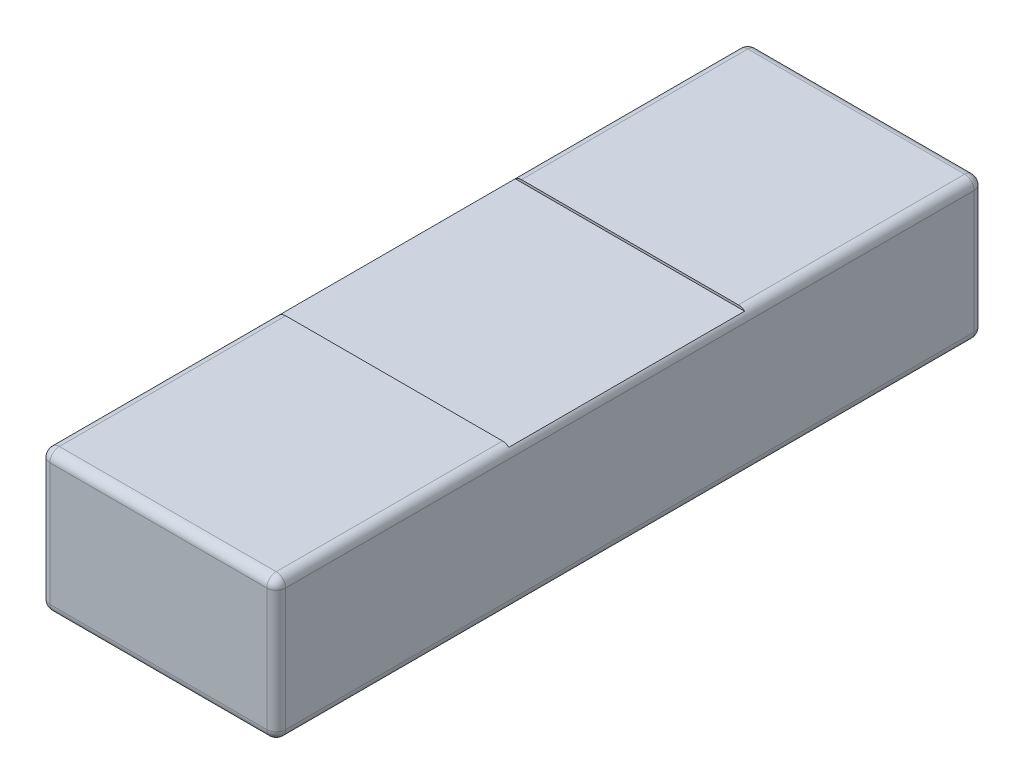
ISO-10303-21;
HEADER;
FILE_DESCRIPTION(('STEP AP214'),'2;1');
FILE_NAME('part.step','',(''),(''),'','','');
FILE_SCHEMA(('AUTOMOTIVE_DESIGN { 1 0 10303 214 1 1 1 1 }'));
ENDSEC;
DATA;
#1=APPLICATION_CONTEXT('core data for automotive mechanical design processes');
#2=APPLICATION_PROTOCOL_DEFINITION('international standard','automotive_design',2000,#1);
#3=PRODUCT_CONTEXT('',#1,'mechanical');
#4=PRODUCT('Part','Part','',(#3));
#5=PRODUCT_RELATED_PRODUCT_CATEGORY('part','',(#4));
#6=PRODUCT_DEFINITION_FORMATION('','',#4);
#7=PRODUCT_DEFINITION_CONTEXT('part definition',#1,'design');
#8=PRODUCT_DEFINITION('design','',#6,#7);
#9=PRODUCT_DEFINITION_SHAPE('','',#8);
#10=(LENGTH_UNIT() NAMED_UNIT(*) SI_UNIT(.MILLI.,.METRE.));
#11=(NAMED_UNIT(*) PLANE_ANGLE_UNIT() SI_UNIT($,.RADIAN.));
#12=(NAMED_UNIT(*) SI_UNIT($,.STERADIAN.) SOLID_ANGLE_UNIT());
#13=UNCERTAINTY_MEASURE_WITH_UNIT(LENGTH_MEASURE(1.E-05),#10,'distance_accuracy_value','');
#14=(GEOMETRIC_REPRESENTATION_CONTEXT(3) GLOBAL_UNCERTAINTY_ASSIGNED_CONTEXT((#13)) GLOBAL_UNIT_ASSIGNED_CONTEXT((#10,
#11,#12)) REPRESENTATION_CONTEXT('',''));
#15=CARTESIAN_POINT('',(0.,0.,0.));
#16=DIRECTION('',(0.,0.,1.));
#17=DIRECTION('',(1.,0.,0.));
#18=AXIS2_PLACEMENT_3D('',#15,#16,#17);
#19=CARTESIAN_POINT('',(0.,0.,0.));
#20=DIRECTION('',(0.,1.,0.));
#21=DIRECTION('',(0.,0.,1.));
#22=AXIS2_PLACEMENT_3D('',#19,#20,#21);
#23=PLANE('',#22);
#24=DIRECTION('',(0.,0.,-1.));
#25=VECTOR('',#24,1.);
#26=CARTESIAN_POINT('',(23.,0.,0.));
#27=LINE('',#26,#25);
#28=CARTESIAN_POINT('',(23.,0.,-73.));
#29=VERTEX_POINT('',#28);
#30=CARTESIAN_POINT('',(23.,0.,-25.));
#31=VERTEX_POINT('',#30);
#32=EDGE_CURVE('E207',#29,#31,#27,.F.);
#33=ORIENTED_EDGE('',*,*,#32,.T.);
#34=DIRECTION('',(1.,0.,0.));
#35=VECTOR('',#34,1.);
#36=CARTESIAN_POINT('',(-42.2838274871656,0.,-25.));
#37=LINE('',#36,#35);
#38=CARTESIAN_POINT('',(-23.,0.,-25.));
#39=VERTEX_POINT('',#38);
#40=EDGE_CURVE('E198',#39,#31,#37,.T.);
#41=ORIENTED_EDGE('',*,*,#40,.F.);
#42=DIRECTION('',(0.,0.,1.));
#43=VECTOR('',#42,1.);
#44=CARTESIAN_POINT('',(-23.,0.,0.));
#45=LINE('',#44,#43);
#46=CARTESIAN_POINT('',(-23.,0.,-73.));
#47=VERTEX_POINT('',#46);
#48=EDGE_CURVE('E429',#39,#47,#45,.F.);
#49=ORIENTED_EDGE('',*,*,#48,.T.);
#50=DIRECTION('',(-1.,0.,0.));
#51=VECTOR('',#50,1.);
#52=CARTESIAN_POINT('',(0.,0.,-73.));
#53=LINE('',#52,#51);
#54=EDGE_CURVE('E214',#47,#29,#53,.F.);
#55=ORIENTED_EDGE('',*,*,#54,.T.);
#56=EDGE_LOOP('',(#33,#41,#49,#55));
#57=FACE_BOUND('',#56,.T.);
#58=ADVANCED_FACE('F42',(#57),#23,.F.);
#59=CARTESIAN_POINT('',(0.,30.,0.));
#60=DIRECTION('',(0.,1.,0.));
#61=DIRECTION('',(0.,0.,1.));
#62=AXIS2_PLACEMENT_3D('',#59,#60,#61);
#63=PLANE('',#62);
#64=DIRECTION('',(1.,0.,0.));
#65=VECTOR('',#64,1.);
#66=CARTESIAN_POINT('',(-49.869727137544,30.,25.));
#67=LINE('',#66,#65);
#68=CARTESIAN_POINT('',(-23.,30.,25.));
#69=VERTEX_POINT('',#68);
#70=CARTESIAN_POINT('',(23.,30.,25.));
#71=VERTEX_POINT('',#70);
#72=EDGE_CURVE('E401',#69,#71,#67,.T.);
#73=ORIENTED_EDGE('',*,*,#72,.F.);
#74=DIRECTION('',(0.,0.,1.));
#75=VECTOR('',#74,1.);
#76=CARTESIAN_POINT('',(-23.,30.,75.));
#77=LINE('',#76,#75);
#78=CARTESIAN_POINT('',(-23.,30.,73.));
#79=VERTEX_POINT('',#78);
#80=EDGE_CURVE('E243',#69,#79,#77,.T.);
#81=ORIENTED_EDGE('',*,*,#80,.T.);
#82=DIRECTION('',(1.,0.,0.));
#83=VECTOR('',#82,1.);
#84=CARTESIAN_POINT('',(25.,30.,73.));
#85=LINE('',#84,#83);
#86=CARTESIAN_POINT('',(23.,30.,73.));
#87=VERTEX_POINT('',#86);
#88=EDGE_CURVE('E251',#79,#87,#85,.T.);
#89=ORIENTED_EDGE('',*,*,#88,.T.);
#90=DIRECTION('',(0.,0.,-1.));
#91=VECTOR('',#90,1.);
#92=CARTESIAN_POINT('',(23.,30.,-75.));
#93=LINE('',#92,#91);
#94=EDGE_CURVE('E256',#87,#71,#93,.T.);
#95=ORIENTED_EDGE('',*,*,#94,.T.);
#96=EDGE_LOOP('',(#73,#81,#89,#95));
#97=FACE_BOUND('',#96,.T.);
#98=ADVANCED_FACE('F497',(#97),#63,.T.);
#99=CARTESIAN_POINT('',(25.,30.,-75.));
#100=DIRECTION('',(-1.,0.,0.));
#101=DIRECTION('',(0.,0.,1.));
#102=AXIS2_PLACEMENT_3D('',#99,#100,#101);
#103=PLANE('',#102);
#104=DIRECTION('',(0.,-1.,0.));
#105=VECTOR('',#104,1.);
#106=CARTESIAN_POINT('',(25.,30.,73.));
#107=LINE('',#106,#105);
#108=CARTESIAN_POINT('',(25.,28.,73.));
#109=VERTEX_POINT('',#108);
#110=CARTESIAN_POINT('',(25.,2.,73.));
#111=VERTEX_POINT('',#110);
#112=EDGE_CURVE('E422',#109,#111,#107,.T.);
#113=ORIENTED_EDGE('',*,*,#112,.T.);
#114=DIRECTION('',(0.,0.,-1.));
#115=VECTOR('',#114,1.);
#116=CARTESIAN_POINT('',(25.,2.,-75.));
#117=LINE('',#116,#115);
#118=CARTESIAN_POINT('',(25.,2.,-73.));
#119=VERTEX_POINT('',#118);
#120=EDGE_CURVE('E425',#111,#119,#117,.T.);
#121=ORIENTED_EDGE('',*,*,#120,.T.);
#122=DIRECTION('',(0.,-1.,0.));
#123=VECTOR('',#122,1.);
#124=CARTESIAN_POINT('',(25.,30.,-73.));
#125=LINE('',#124,#123);
#126=CARTESIAN_POINT('',(25.,28.,-73.));
#127=VERTEX_POINT('',#126);
#128=EDGE_CURVE('E419',#119,#127,#125,.F.);
#129=ORIENTED_EDGE('',*,*,#128,.T.);
#130=DIRECTION('',(0.,0.,-1.));
#131=VECTOR('',#130,1.);
#132=CARTESIAN_POINT('',(25.,28.,75.));
#133=LINE('',#132,#131);
#134=EDGE_CURVE('E363',#127,#109,#133,.F.);
#135=ORIENTED_EDGE('',*,*,#134,.T.);
#136=EDGE_LOOP('',(#113,#121,#129,#135));
#137=FACE_BOUND('',#136,.T.);
#138=ADVANCED_FACE('F451',(#137),#103,.F.);
#139=CARTESIAN_POINT('',(-25.,30.,-75.));
#140=DIRECTION('',(0.,0.,1.));
#141=DIRECTION('',(1.,0.,0.));
#142=AXIS2_PLACEMENT_3D('',#139,#140,#141);
#143=PLANE('',#142);
#144=DIRECTION('',(-1.,0.,0.));
#145=VECTOR('',#144,1.);
#146=CARTESIAN_POINT('',(25.,28.,-75.));
#147=LINE('',#146,#145);
#148=CARTESIAN_POINT('',(-23.,28.,-75.));
#149=VERTEX_POINT('',#148);
#150=CARTESIAN_POINT('',(23.,28.,-75.));
#151=VERTEX_POINT('',#150);
#152=EDGE_CURVE('E233',#149,#151,#147,.F.);
#153=ORIENTED_EDGE('',*,*,#152,.T.);
#154=DIRECTION('',(0.,-1.,0.));
#155=VECTOR('',#154,1.);
#156=CARTESIAN_POINT('',(23.,30.,-75.));
#157=LINE('',#156,#155);
#158=CARTESIAN_POINT('',(23.,2.,-75.));
#159=VERTEX_POINT('',#158);
#160=EDGE_CURVE('E239',#151,#159,#157,.T.);
#161=ORIENTED_EDGE('',*,*,#160,.T.);
#162=DIRECTION('',(-1.,0.,0.));
#163=VECTOR('',#162,1.);
#164=CARTESIAN_POINT('',(-25.,2.,-75.));
#165=LINE('',#164,#163);
#166=CARTESIAN_POINT('',(-23.,2.,-75.));
#167=VERTEX_POINT('',#166);
#168=EDGE_CURVE('E236',#159,#167,#165,.T.);
#169=ORIENTED_EDGE('',*,*,#168,.T.);
#170=DIRECTION('',(0.,-1.,0.));
#171=VECTOR('',#170,1.);
#172=CARTESIAN_POINT('',(-23.,30.,-75.));
#173=LINE('',#172,#171);
#174=EDGE_CURVE('E230',#167,#149,#173,.F.);
#175=ORIENTED_EDGE('',*,*,#174,.T.);
#176=EDGE_LOOP('',(#153,#161,#169,#175));
#177=FACE_BOUND('',#176,.T.);
#178=ADVANCED_FACE('F518',(#177),#143,.F.);
#179=CARTESIAN_POINT('',(-25.,30.,-75.));
#180=DIRECTION('',(1.,0.,0.));
#181=DIRECTION('',(0.,0.,-1.));
#182=AXIS2_PLACEMENT_3D('',#179,#180,#181);
#183=PLANE('',#182);
#184=DIRECTION('',(0.,0.,1.));
#185=VECTOR('',#184,1.);
#186=CARTESIAN_POINT('',(-25.,28.,-75.));
#187=LINE('',#186,#185);
#188=CARTESIAN_POINT('',(-25.,28.,73.));
#189=VERTEX_POINT('',#188);
#190=CARTESIAN_POINT('',(-25.,28.,-73.));
#191=VERTEX_POINT('',#190);
#192=EDGE_CURVE('E266',#189,#191,#187,.F.);
#193=ORIENTED_EDGE('',*,*,#192,.T.);
#194=DIRECTION('',(0.,-1.,0.));
#195=VECTOR('',#194,1.);
#196=CARTESIAN_POINT('',(-25.,30.,-73.));
#197=LINE('',#196,#195);
#198=CARTESIAN_POINT('',(-25.,2.,-73.));
#199=VERTEX_POINT('',#198);
#200=EDGE_CURVE('E269',#191,#199,#197,.T.);
#201=ORIENTED_EDGE('',*,*,#200,.T.);
#202=DIRECTION('',(0.,0.,1.));
#203=VECTOR('',#202,1.);
#204=CARTESIAN_POINT('',(-25.,2.,-75.));
#205=LINE('',#204,#203);
#206=CARTESIAN_POINT('',(-25.,2.,73.));
#207=VERTEX_POINT('',#206);
#208=EDGE_CURVE('E260',#199,#207,#205,.T.);
#209=ORIENTED_EDGE('',*,*,#208,.T.);
#210=DIRECTION('',(0.,-1.,0.));
#211=VECTOR('',#210,1.);
#212=CARTESIAN_POINT('',(-25.,30.,73.));
#213=LINE('',#212,#211);
#214=EDGE_CURVE('E263',#207,#189,#213,.F.);
#215=ORIENTED_EDGE('',*,*,#214,.T.);
#216=EDGE_LOOP('',(#193,#201,#209,#215));
#217=FACE_BOUND('',#216,.T.);
#218=ADVANCED_FACE('F478',(#217),#183,.F.);
#219=CARTESIAN_POINT('',(-25.,30.,75.));
#220=DIRECTION('',(0.,0.,-1.));
#221=DIRECTION('',(-1.,0.,0.));
#222=AXIS2_PLACEMENT_3D('',#219,#220,#221);
#223=PLANE('',#222);
#224=DIRECTION('',(1.,0.,0.));
#225=VECTOR('',#224,1.);
#226=CARTESIAN_POINT('',(-25.,2.,75.));
#227=LINE('',#226,#225);
#228=CARTESIAN_POINT('',(-23.,2.,75.));
#229=VERTEX_POINT('',#228);
#230=CARTESIAN_POINT('',(23.,2.,75.));
#231=VERTEX_POINT('',#230);
#232=EDGE_CURVE('E223',#229,#231,#227,.T.);
#233=ORIENTED_EDGE('',*,*,#232,.T.);
#234=DIRECTION('',(0.,-1.,0.));
#235=VECTOR('',#234,1.);
#236=CARTESIAN_POINT('',(23.,30.,75.));
#237=LINE('',#236,#235);
#238=CARTESIAN_POINT('',(23.,28.,75.));
#239=VERTEX_POINT('',#238);
#240=EDGE_CURVE('E226',#231,#239,#237,.F.);
#241=ORIENTED_EDGE('',*,*,#240,.T.);
#242=DIRECTION('',(1.,0.,0.));
#243=VECTOR('',#242,1.);
#244=CARTESIAN_POINT('',(-25.,28.,75.));
#245=LINE('',#244,#243);
#246=CARTESIAN_POINT('',(-23.,28.,75.));
#247=VERTEX_POINT('',#246);
#248=EDGE_CURVE('E220',#239,#247,#245,.F.);
#249=ORIENTED_EDGE('',*,*,#248,.T.);
#250=DIRECTION('',(0.,-1.,0.));
#251=VECTOR('',#250,1.);
#252=CARTESIAN_POINT('',(-23.,30.,75.));
#253=LINE('',#252,#251);
#254=EDGE_CURVE('E213',#247,#229,#253,.T.);
#255=ORIENTED_EDGE('',*,*,#254,.T.);
#256=EDGE_LOOP('',(#233,#241,#249,#255));
#257=FACE_BOUND('',#256,.T.);
#258=ADVANCED_FACE('F547',(#257),#223,.F.);
#259=DIRECTION('',(-1.,0.,0.));
#260=VECTOR('',#259,1.);
#261=CARTESIAN_POINT('',(-49.869727137544,30.,-25.));
#262=LINE('',#261,#260);
#263=CARTESIAN_POINT('',(23.,30.,-25.));
#264=VERTEX_POINT('',#263);
#265=CARTESIAN_POINT('',(-23.,30.,-25.));
#266=VERTEX_POINT('',#265);
#267=EDGE_CURVE('E396',#264,#266,#262,.T.);
#268=ORIENTED_EDGE('',*,*,#267,.F.);
#269=CARTESIAN_POINT('',(23.,30.,-73.));
#270=VERTEX_POINT('',#269);
#271=EDGE_CURVE('E255',#264,#270,#93,.T.);
#272=ORIENTED_EDGE('',*,*,#271,.T.);
#273=DIRECTION('',(-1.,0.,0.));
#274=VECTOR('',#273,1.);
#275=CARTESIAN_POINT('',(-25.,30.,-73.));
#276=LINE('',#275,#274);
#277=CARTESIAN_POINT('',(-23.,30.,-73.));
#278=VERTEX_POINT('',#277);
#279=EDGE_CURVE('E248',#270,#278,#276,.T.);
#280=ORIENTED_EDGE('',*,*,#279,.T.);
#281=EDGE_CURVE('E244',#278,#266,#77,.T.);
#282=ORIENTED_EDGE('',*,*,#281,.T.);
#283=EDGE_LOOP('',(#268,#272,#280,#282));
#284=FACE_BOUND('',#283,.T.);
#285=ADVANCED_FACE('F504',(#284),#63,.T.);
#286=CARTESIAN_POINT('',(-23.,0.,73.));
#287=VERTEX_POINT('',#286);
#288=CARTESIAN_POINT('',(-23.,0.,25.));
#289=VERTEX_POINT('',#288);
#290=EDGE_CURVE('E196',#287,#289,#45,.F.);
#291=ORIENTED_EDGE('',*,*,#290,.T.);
#292=DIRECTION('',(-1.,0.,0.));
#293=VECTOR('',#292,1.);
#294=CARTESIAN_POINT('',(-42.2838274871656,0.,25.));
#295=LINE('',#294,#293);
#296=CARTESIAN_POINT('',(23.,0.,25.));
#297=VERTEX_POINT('',#296);
#298=EDGE_CURVE('E181',#297,#289,#295,.T.);
#299=ORIENTED_EDGE('',*,*,#298,.F.);
#300=CARTESIAN_POINT('',(23.,0.,73.));
#301=VERTEX_POINT('',#300);
#302=EDGE_CURVE('E193',#297,#301,#27,.F.);
#303=ORIENTED_EDGE('',*,*,#302,.T.);
#304=DIRECTION('',(1.,0.,0.));
#305=VECTOR('',#304,1.);
#306=CARTESIAN_POINT('',(0.,0.,73.));
#307=LINE('',#306,#305);
#308=EDGE_CURVE('E208',#301,#287,#307,.F.);
#309=ORIENTED_EDGE('',*,*,#308,.T.);
#310=EDGE_LOOP('',(#291,#299,#303,#309));
#311=FACE_BOUND('',#310,.T.);
#312=ADVANCED_FACE('F192',(#311),#23,.F.);
#313=CARTESIAN_POINT('',(-23.,28.,0.));
#314=DIRECTION('',(0.,0.,-1.));
#315=DIRECTION('',(-1.,0.,0.));
#316=AXIS2_PLACEMENT_3D('',#313,#314,#315);
#317=CYLINDRICAL_SURFACE('',#316,2.);
#318=CARTESIAN_POINT('',(-23.,28.,25.));
#319=DIRECTION('',(0.,0.,1.));
#320=DIRECTION('',(1.,0.,0.));
#321=AXIS2_PLACEMENT_3D('',#318,#319,#320);
#322=CIRCLE('',#321,2.);
#323=CARTESIAN_POINT('',(-24.3228756555323,29.5,25.));
#324=VERTEX_POINT('',#323);
#325=EDGE_CURVE('E277',#324,#69,#322,.F.);
#326=ORIENTED_EDGE('',*,*,#325,.F.);
#327=DIRECTION('',(0.,0.,-1.));
#328=VECTOR('',#327,1.);
#329=CARTESIAN_POINT('',(-24.3228756555323,29.5,0.));
#330=LINE('',#329,#328);
#331=CARTESIAN_POINT('',(-24.3228756555323,29.5,-25.));
#332=VERTEX_POINT('',#331);
#333=EDGE_CURVE('E404',#324,#332,#330,.T.);
#334=ORIENTED_EDGE('',*,*,#333,.T.);
#335=CARTESIAN_POINT('',(-23.,28.,-25.));
#336=DIRECTION('',(0.,0.,-1.));
#337=DIRECTION('',(-1.,0.,0.));
#338=AXIS2_PLACEMENT_3D('',#335,#336,#337);
#339=CIRCLE('',#338,2.);
#340=EDGE_CURVE('E412',#266,#332,#339,.F.);
#341=ORIENTED_EDGE('',*,*,#340,.F.);
#342=ORIENTED_EDGE('',*,*,#281,.F.);
#343=CARTESIAN_POINT('',(-23.,28.,-73.));
#344=DIRECTION('',(0.,0.,-1.));
#345=DIRECTION('',(-1.,0.,0.));
#346=AXIS2_PLACEMENT_3D('',#343,#344,#345);
#347=CIRCLE('',#346,2.);
#348=EDGE_CURVE('E355',#191,#278,#347,.T.);
#349=ORIENTED_EDGE('',*,*,#348,.F.);
#350=ORIENTED_EDGE('',*,*,#192,.F.);
#351=CARTESIAN_POINT('',(-23.,28.,73.));
#352=DIRECTION('',(0.,0.,1.));
#353=DIRECTION('',(1.,0.,0.));
#354=AXIS2_PLACEMENT_3D('',#351,#352,#353);
#355=CIRCLE('',#354,2.);
#356=EDGE_CURVE('E359',#79,#189,#355,.T.);
#357=ORIENTED_EDGE('',*,*,#356,.F.);
#358=ORIENTED_EDGE('',*,*,#80,.F.);
#359=EDGE_LOOP('',(#326,#334,#341,#342,#349,#350,#357,#358));
#360=FACE_BOUND('',#359,.T.);
#361=ADVANCED_FACE('F44',(#360),#317,.T.);
#362=CARTESIAN_POINT('',(-23.,28.,73.));
#363=DIRECTION('',(-1.,0.,0.));
#364=DIRECTION('',(0.,0.,1.));
#365=AXIS2_PLACEMENT_3D('',#362,#363,#364);
#366=SPHERICAL_SURFACE('',#365,2.);
#367=CARTESIAN_POINT('',(-23.,28.,73.));
#368=DIRECTION('',(-1.,0.,0.));
#369=DIRECTION('',(0.,0.,1.));
#370=AXIS2_PLACEMENT_3D('',#367,#368,#369);
#371=CIRCLE('',#370,2.);
#372=EDGE_CURVE('E347',#79,#247,#371,.F.);
#373=ORIENTED_EDGE('',*,*,#372,.F.);
#374=ORIENTED_EDGE('',*,*,#356,.T.);
#375=CARTESIAN_POINT('',(-23.,28.,73.));
#376=DIRECTION('',(0.,1.,0.));
#377=DIRECTION('',(0.,0.,1.));
#378=AXIS2_PLACEMENT_3D('',#375,#376,#377);
#379=CIRCLE('',#378,2.);
#380=EDGE_CURVE('E351',#247,#189,#379,.F.);
#381=ORIENTED_EDGE('',*,*,#380,.F.);
#382=EDGE_LOOP('',(#373,#374,#381));
#383=FACE_BOUND('',#382,.T.);
#384=ADVANCED_FACE('F488',(#383),#366,.T.);
#385=CARTESIAN_POINT('',(-23.,28.,-73.));
#386=DIRECTION('',(0.,1.,0.));
#387=DIRECTION('',(0.,0.,1.));
#388=AXIS2_PLACEMENT_3D('',#385,#386,#387);
#389=SPHERICAL_SURFACE('',#388,2.);
#390=CARTESIAN_POINT('',(-23.,28.,-73.));
#391=DIRECTION('',(0.,1.,0.));
#392=DIRECTION('',(0.,0.,1.));
#393=AXIS2_PLACEMENT_3D('',#390,#391,#392);
#394=CIRCLE('',#393,2.);
#395=EDGE_CURVE('E339',#191,#149,#394,.F.);
#396=ORIENTED_EDGE('',*,*,#395,.F.);
#397=ORIENTED_EDGE('',*,*,#348,.T.);
#398=CARTESIAN_POINT('',(-23.,28.,-73.));
#399=DIRECTION('',(-1.,0.,0.));
#400=DIRECTION('',(0.,0.,1.));
#401=AXIS2_PLACEMENT_3D('',#398,#399,#400);
#402=CIRCLE('',#401,2.);
#403=EDGE_CURVE('E343',#149,#278,#402,.F.);
#404=ORIENTED_EDGE('',*,*,#403,.F.);
#405=EDGE_LOOP('',(#396,#397,#404));
#406=FACE_BOUND('',#405,.T.);
#407=ADVANCED_FACE('F525',(#406),#389,.T.);
#408=CARTESIAN_POINT('',(-23.,30.,73.));
#409=DIRECTION('',(0.,-1.,0.));
#410=DIRECTION('',(0.,0.,-1.));
#411=AXIS2_PLACEMENT_3D('',#408,#409,#410);
#412=CYLINDRICAL_SURFACE('',#411,2.);
#413=ORIENTED_EDGE('',*,*,#380,.T.);
#414=ORIENTED_EDGE('',*,*,#214,.F.);
#415=CARTESIAN_POINT('',(-23.,2.,73.));
#416=DIRECTION('',(0.,-1.,0.));
#417=DIRECTION('',(0.,0.,-1.));
#418=AXIS2_PLACEMENT_3D('',#415,#416,#417);
#419=CIRCLE('',#418,2.);
#420=EDGE_CURVE('E331',#229,#207,#419,.T.);
#421=ORIENTED_EDGE('',*,*,#420,.F.);
#422=ORIENTED_EDGE('',*,*,#254,.F.);
#423=EDGE_LOOP('',(#413,#414,#421,#422));
#424=FACE_BOUND('',#423,.T.);
#425=ADVANCED_FACE('F474',(#424),#412,.T.);
#426=CARTESIAN_POINT('',(0.,28.,73.));
#427=DIRECTION('',(-1.,0.,0.));
#428=DIRECTION('',(0.,0.,1.));
#429=AXIS2_PLACEMENT_3D('',#426,#427,#428);
#430=CYLINDRICAL_SURFACE('',#429,2.);
#431=ORIENTED_EDGE('',*,*,#372,.T.);
#432=ORIENTED_EDGE('',*,*,#248,.F.);
#433=CARTESIAN_POINT('',(23.,28.,73.));
#434=DIRECTION('',(1.,0.,0.));
#435=DIRECTION('',(0.,0.,-1.));
#436=AXIS2_PLACEMENT_3D('',#433,#434,#435);
#437=CIRCLE('',#436,2.);
#438=EDGE_CURVE('E327',#87,#239,#437,.T.);
#439=ORIENTED_EDGE('',*,*,#438,.F.);
#440=ORIENTED_EDGE('',*,*,#88,.F.);
#441=EDGE_LOOP('',(#431,#432,#439,#440));
#442=FACE_BOUND('',#441,.T.);
#443=ADVANCED_FACE('F493',(#442),#430,.T.);
#444=CARTESIAN_POINT('',(23.,28.,0.));
#445=DIRECTION('',(0.,0.,1.));
#446=DIRECTION('',(1.,0.,0.));
#447=AXIS2_PLACEMENT_3D('',#444,#445,#446);
#448=CYLINDRICAL_SURFACE('',#447,2.);
#449=CARTESIAN_POINT('',(23.,28.,25.));
#450=DIRECTION('',(0.,0.,1.));
#451=DIRECTION('',(1.,0.,0.));
#452=AXIS2_PLACEMENT_3D('',#449,#450,#451);
#453=CIRCLE('',#452,2.);
#454=CARTESIAN_POINT('',(24.3228756555323,29.5,25.));
#455=VERTEX_POINT('',#454);
#456=EDGE_CURVE('E370',#71,#455,#453,.F.);
#457=ORIENTED_EDGE('',*,*,#456,.F.);
#458=ORIENTED_EDGE('',*,*,#94,.F.);
#459=CARTESIAN_POINT('',(23.,28.,73.));
#460=DIRECTION('',(0.,0.,1.));
#461=DIRECTION('',(1.,0.,0.));
#462=AXIS2_PLACEMENT_3D('',#459,#460,#461);
#463=CIRCLE('',#462,2.);
#464=EDGE_CURVE('E324',#109,#87,#463,.T.);
#465=ORIENTED_EDGE('',*,*,#464,.F.);
#466=ORIENTED_EDGE('',*,*,#134,.F.);
#467=CARTESIAN_POINT('',(23.,28.,-73.));
#468=DIRECTION('',(0.,0.,-1.));
#469=DIRECTION('',(-1.,0.,0.));
#470=AXIS2_PLACEMENT_3D('',#467,#468,#469);
#471=CIRCLE('',#470,2.);
#472=EDGE_CURVE('E320',#270,#127,#471,.T.);
#473=ORIENTED_EDGE('',*,*,#472,.F.);
#474=ORIENTED_EDGE('',*,*,#271,.F.);
#475=CARTESIAN_POINT('',(23.,28.,-25.));
#476=DIRECTION('',(0.,0.,-1.));
#477=DIRECTION('',(-1.,0.,0.));
#478=AXIS2_PLACEMENT_3D('',#475,#476,#477);
#479=CIRCLE('',#478,2.);
#480=CARTESIAN_POINT('',(24.3228756555322,29.5,-25.));
#481=VERTEX_POINT('',#480);
#482=EDGE_CURVE('E367',#481,#264,#479,.F.);
#483=ORIENTED_EDGE('',*,*,#482,.F.);
#484=DIRECTION('',(0.,0.,1.));
#485=VECTOR('',#484,1.);
#486=CARTESIAN_POINT('',(24.3228756555323,29.5,0.));
#487=LINE('',#486,#485);
#488=EDGE_CURVE('E273',#481,#455,#487,.T.);
#489=ORIENTED_EDGE('',*,*,#488,.T.);
#490=EDGE_LOOP('',(#457,#458,#465,#466,#473,#474,#483,#489));
#491=FACE_BOUND('',#490,.T.);
#492=ADVANCED_FACE('F514',(#491),#448,.T.);
#493=CARTESIAN_POINT('',(0.,28.,-73.));
#494=DIRECTION('',(1.,0.,0.));
#495=DIRECTION('',(0.,0.,-1.));
#496=AXIS2_PLACEMENT_3D('',#493,#494,#495);
#497=CYLINDRICAL_SURFACE('',#496,2.);
#498=ORIENTED_EDGE('',*,*,#403,.T.);
#499=ORIENTED_EDGE('',*,*,#279,.F.);
#500=CARTESIAN_POINT('',(23.,28.,-73.));
#501=DIRECTION('',(1.,0.,0.));
#502=DIRECTION('',(0.,0.,-1.));
#503=AXIS2_PLACEMENT_3D('',#500,#501,#502);
#504=CIRCLE('',#503,2.);
#505=EDGE_CURVE('E316',#151,#270,#504,.T.);
#506=ORIENTED_EDGE('',*,*,#505,.F.);
#507=ORIENTED_EDGE('',*,*,#152,.F.);
#508=EDGE_LOOP('',(#498,#499,#506,#507));
#509=FACE_BOUND('',#508,.T.);
#510=ADVANCED_FACE('F510',(#509),#497,.T.);
#511=CARTESIAN_POINT('',(-23.,30.,-73.));
#512=DIRECTION('',(0.,-1.,0.));
#513=DIRECTION('',(0.,0.,-1.));
#514=AXIS2_PLACEMENT_3D('',#511,#512,#513);
#515=CYLINDRICAL_SURFACE('',#514,2.);
#516=ORIENTED_EDGE('',*,*,#395,.T.);
#517=ORIENTED_EDGE('',*,*,#174,.F.);
#518=CARTESIAN_POINT('',(-23.,2.,-73.));
#519=DIRECTION('',(0.,-1.,0.));
#520=DIRECTION('',(0.,0.,-1.));
#521=AXIS2_PLACEMENT_3D('',#518,#519,#520);
#522=CIRCLE('',#521,2.);
#523=EDGE_CURVE('E312',#199,#167,#522,.T.);
#524=ORIENTED_EDGE('',*,*,#523,.F.);
#525=ORIENTED_EDGE('',*,*,#200,.F.);
#526=EDGE_LOOP('',(#516,#517,#524,#525));
#527=FACE_BOUND('',#526,.T.);
#528=ADVANCED_FACE('F523',(#527),#515,.T.);
#529=CARTESIAN_POINT('',(-23.,2.,-75.));
#530=DIRECTION('',(0.,0.,1.));
#531=DIRECTION('',(1.,0.,0.));
#532=AXIS2_PLACEMENT_3D('',#529,#530,#531);
#533=CYLINDRICAL_SURFACE('',#532,2.);
#534=CARTESIAN_POINT('',(-23.,2.,-25.));
#535=DIRECTION('',(0.,0.,-1.));
#536=DIRECTION('',(-1.,0.,0.));
#537=AXIS2_PLACEMENT_3D('',#534,#535,#536);
#538=CIRCLE('',#537,2.);
#539=CARTESIAN_POINT('',(-24.3228756555323,0.5,-25.));
#540=VERTEX_POINT('',#539);
#541=EDGE_CURVE('E385',#540,#39,#538,.F.);
#542=ORIENTED_EDGE('',*,*,#541,.F.);
#543=DIRECTION('',(0.,0.,1.));
#544=VECTOR('',#543,1.);
#545=CARTESIAN_POINT('',(-24.3228756555323,0.5,-75.));
#546=LINE('',#545,#544);
#547=CARTESIAN_POINT('',(-24.3228756555323,0.5,25.));
#548=VERTEX_POINT('',#547);
#549=EDGE_CURVE('E377',#540,#548,#546,.T.);
#550=ORIENTED_EDGE('',*,*,#549,.T.);
#551=CARTESIAN_POINT('',(-23.,2.,25.));
#552=DIRECTION('',(0.,0.,1.));
#553=DIRECTION('',(1.,0.,0.));
#554=AXIS2_PLACEMENT_3D('',#551,#552,#553);
#555=CIRCLE('',#554,2.);
#556=EDGE_CURVE('E383',#289,#548,#555,.F.);
#557=ORIENTED_EDGE('',*,*,#556,.F.);
#558=ORIENTED_EDGE('',*,*,#290,.F.);
#559=CARTESIAN_POINT('',(-23.,2.,73.));
#560=DIRECTION('',(0.,0.,1.));
#561=DIRECTION('',(1.,0.,0.));
#562=AXIS2_PLACEMENT_3D('',#559,#560,#561);
#563=CIRCLE('',#562,2.);
#564=EDGE_CURVE('E335',#207,#287,#563,.T.);
#565=ORIENTED_EDGE('',*,*,#564,.F.);
#566=ORIENTED_EDGE('',*,*,#208,.F.);
#567=CARTESIAN_POINT('',(-23.,2.,-73.));
#568=DIRECTION('',(0.,0.,-1.));
#569=DIRECTION('',(-1.,0.,0.));
#570=AXIS2_PLACEMENT_3D('',#567,#568,#569);
#571=CIRCLE('',#570,2.);
#572=EDGE_CURVE('E309',#47,#199,#571,.T.);
#573=ORIENTED_EDGE('',*,*,#572,.F.);
#574=ORIENTED_EDGE('',*,*,#48,.F.);
#575=EDGE_LOOP('',(#542,#550,#557,#558,#565,#566,#573,#574));
#576=FACE_BOUND('',#575,.T.);
#577=ADVANCED_FACE('F382',(#576),#533,.T.);
#578=CARTESIAN_POINT('',(-23.,2.,73.));
#579=DIRECTION('',(-1.,0.,0.));
#580=DIRECTION('',(0.,-1.,0.));
#581=AXIS2_PLACEMENT_3D('',#578,#579,#580);
#582=SPHERICAL_SURFACE('',#581,2.);
#583=ORIENTED_EDGE('',*,*,#420,.T.);
#584=ORIENTED_EDGE('',*,*,#564,.T.);
#585=CARTESIAN_POINT('',(-23.,2.,73.));
#586=DIRECTION('',(-1.,0.,0.));
#587=DIRECTION('',(0.,0.,1.));
#588=AXIS2_PLACEMENT_3D('',#585,#586,#587);
#589=CIRCLE('',#588,2.);
#590=EDGE_CURVE('E305',#229,#287,#589,.F.);
#591=ORIENTED_EDGE('',*,*,#590,.F.);
#592=EDGE_LOOP('',(#583,#584,#591));
#593=FACE_BOUND('',#592,.T.);
#594=ADVANCED_FACE('F469',(#593),#582,.T.);
#595=CARTESIAN_POINT('',(23.,28.,73.));
#596=DIRECTION('',(0.,1.,0.));
#597=DIRECTION('',(0.,0.,1.));
#598=AXIS2_PLACEMENT_3D('',#595,#596,#597);
#599=SPHERICAL_SURFACE('',#598,2.);
#600=ORIENTED_EDGE('',*,*,#464,.T.);
#601=ORIENTED_EDGE('',*,*,#438,.T.);
#602=CARTESIAN_POINT('',(23.,28.,73.));
#603=DIRECTION('',(0.,1.,0.));
#604=DIRECTION('',(0.,0.,1.));
#605=AXIS2_PLACEMENT_3D('',#602,#603,#604);
#606=CIRCLE('',#605,2.);
#607=EDGE_CURVE('E302',#109,#239,#606,.F.);
#608=ORIENTED_EDGE('',*,*,#607,.F.);
#609=EDGE_LOOP('',(#600,#601,#608));
#610=FACE_BOUND('',#609,.T.);
#611=ADVANCED_FACE('F663',(#610),#599,.T.);
#612=CARTESIAN_POINT('',(23.,28.,-73.));
#613=DIRECTION('',(0.,1.,0.));
#614=DIRECTION('',(0.,0.,1.));
#615=AXIS2_PLACEMENT_3D('',#612,#613,#614);
#616=SPHERICAL_SURFACE('',#615,2.);
#617=ORIENTED_EDGE('',*,*,#505,.T.);
#618=ORIENTED_EDGE('',*,*,#472,.T.);
#619=CARTESIAN_POINT('',(23.,28.,-73.));
#620=DIRECTION('',(0.,1.,0.));
#621=DIRECTION('',(0.,0.,1.));
#622=AXIS2_PLACEMENT_3D('',#619,#620,#621);
#623=CIRCLE('',#622,2.);
#624=EDGE_CURVE('E298',#151,#127,#623,.F.);
#625=ORIENTED_EDGE('',*,*,#624,.F.);
#626=EDGE_LOOP('',(#617,#618,#625));
#627=FACE_BOUND('',#626,.T.);
#628=ADVANCED_FACE('F516',(#627),#616,.T.);
#629=CARTESIAN_POINT('',(-23.,2.,-73.));
#630=DIRECTION('',(-1.,0.,0.));
#631=DIRECTION('',(0.,-1.,0.));
#632=AXIS2_PLACEMENT_3D('',#629,#630,#631);
#633=SPHERICAL_SURFACE('',#632,2.);
#634=ORIENTED_EDGE('',*,*,#572,.T.);
#635=ORIENTED_EDGE('',*,*,#523,.T.);
#636=CARTESIAN_POINT('',(-23.,2.,-73.));
#637=DIRECTION('',(-1.,0.,0.));
#638=DIRECTION('',(0.,0.,1.));
#639=AXIS2_PLACEMENT_3D('',#636,#637,#638);
#640=CIRCLE('',#639,2.);
#641=EDGE_CURVE('E294',#47,#167,#640,.F.);
#642=ORIENTED_EDGE('',*,*,#641,.F.);
#643=EDGE_LOOP('',(#634,#635,#642));
#644=FACE_BOUND('',#643,.T.);
#645=ADVANCED_FACE('F649',(#644),#633,.T.);
#646=CARTESIAN_POINT('',(-25.,2.,73.));
#647=DIRECTION('',(1.,0.,0.));
#648=DIRECTION('',(0.,0.,-1.));
#649=AXIS2_PLACEMENT_3D('',#646,#647,#648);
#650=CYLINDRICAL_SURFACE('',#649,2.);
#651=ORIENTED_EDGE('',*,*,#590,.T.);
#652=ORIENTED_EDGE('',*,*,#308,.F.);
#653=CARTESIAN_POINT('',(23.,2.,73.));
#654=DIRECTION('',(1.,0.,0.));
#655=DIRECTION('',(0.,0.,-1.));
#656=AXIS2_PLACEMENT_3D('',#653,#654,#655);
#657=CIRCLE('',#656,2.);
#658=EDGE_CURVE('E291',#231,#301,#657,.T.);
#659=ORIENTED_EDGE('',*,*,#658,.F.);
#660=ORIENTED_EDGE('',*,*,#232,.F.);
#661=EDGE_LOOP('',(#651,#652,#659,#660));
#662=FACE_BOUND('',#661,.T.);
#663=ADVANCED_FACE('F464',(#662),#650,.T.);
#664=CARTESIAN_POINT('',(23.,30.,73.));
#665=DIRECTION('',(0.,-1.,0.));
#666=DIRECTION('',(0.,0.,-1.));
#667=AXIS2_PLACEMENT_3D('',#664,#665,#666);
#668=CYLINDRICAL_SURFACE('',#667,2.);
#669=ORIENTED_EDGE('',*,*,#607,.T.);
#670=ORIENTED_EDGE('',*,*,#240,.F.);
#671=CARTESIAN_POINT('',(23.,2.,73.));
#672=DIRECTION('',(0.,-1.,0.));
#673=DIRECTION('',(0.,0.,-1.));
#674=AXIS2_PLACEMENT_3D('',#671,#672,#673);
#675=CIRCLE('',#674,2.);
#676=EDGE_CURVE('E287',#111,#231,#675,.T.);
#677=ORIENTED_EDGE('',*,*,#676,.F.);
#678=ORIENTED_EDGE('',*,*,#112,.F.);
#679=EDGE_LOOP('',(#669,#670,#677,#678));
#680=FACE_BOUND('',#679,.T.);
#681=ADVANCED_FACE('F457',(#680),#668,.T.);
#682=CARTESIAN_POINT('',(23.,30.,-73.));
#683=DIRECTION('',(0.,-1.,0.));
#684=DIRECTION('',(0.,0.,-1.));
#685=AXIS2_PLACEMENT_3D('',#682,#683,#684);
#686=CYLINDRICAL_SURFACE('',#685,2.);
#687=ORIENTED_EDGE('',*,*,#624,.T.);
#688=ORIENTED_EDGE('',*,*,#128,.F.);
#689=CARTESIAN_POINT('',(23.,2.,-73.));
#690=DIRECTION('',(0.,-1.,0.));
#691=DIRECTION('',(0.,0.,-1.));
#692=AXIS2_PLACEMENT_3D('',#689,#690,#691);
#693=CIRCLE('',#692,2.);
#694=EDGE_CURVE('E283',#159,#119,#693,.T.);
#695=ORIENTED_EDGE('',*,*,#694,.F.);
#696=ORIENTED_EDGE('',*,*,#160,.F.);
#697=EDGE_LOOP('',(#687,#688,#695,#696));
#698=FACE_BOUND('',#697,.T.);
#699=ADVANCED_FACE('F447',(#698),#686,.T.);
#700=CARTESIAN_POINT('',(-25.,2.,-73.));
#701=DIRECTION('',(-1.,0.,0.));
#702=DIRECTION('',(0.,0.,1.));
#703=AXIS2_PLACEMENT_3D('',#700,#701,#702);
#704=CYLINDRICAL_SURFACE('',#703,2.);
#705=ORIENTED_EDGE('',*,*,#641,.T.);
#706=ORIENTED_EDGE('',*,*,#168,.F.);
#707=CARTESIAN_POINT('',(23.,2.,-73.));
#708=DIRECTION('',(1.,0.,0.));
#709=DIRECTION('',(0.,0.,-1.));
#710=AXIS2_PLACEMENT_3D('',#707,#708,#709);
#711=CIRCLE('',#710,2.);
#712=EDGE_CURVE('E280',#29,#159,#711,.T.);
#713=ORIENTED_EDGE('',*,*,#712,.F.);
#714=ORIENTED_EDGE('',*,*,#54,.F.);
#715=EDGE_LOOP('',(#705,#706,#713,#714));
#716=FACE_BOUND('',#715,.T.);
#717=ADVANCED_FACE('F439',(#716),#704,.T.);
#718=CARTESIAN_POINT('',(23.,2.,73.));
#719=DIRECTION('',(0.,0.,1.));
#720=DIRECTION('',(0.,-1.,0.));
#721=AXIS2_PLACEMENT_3D('',#718,#719,#720);
#722=SPHERICAL_SURFACE('',#721,2.);
#723=ORIENTED_EDGE('',*,*,#676,.T.);
#724=ORIENTED_EDGE('',*,*,#658,.T.);
#725=CARTESIAN_POINT('',(23.,2.,73.));
#726=DIRECTION('',(0.,0.,1.));
#727=DIRECTION('',(1.,0.,0.));
#728=AXIS2_PLACEMENT_3D('',#725,#726,#727);
#729=CIRCLE('',#728,2.);
#730=EDGE_CURVE('E204',#111,#301,#729,.F.);
#731=ORIENTED_EDGE('',*,*,#730,.F.);
#732=EDGE_LOOP('',(#723,#724,#731));
#733=FACE_BOUND('',#732,.T.);
#734=ADVANCED_FACE('F460',(#733),#722,.T.);
#735=CARTESIAN_POINT('',(23.,2.,-73.));
#736=DIRECTION('',(0.,0.,-1.));
#737=DIRECTION('',(0.,1.,0.));
#738=AXIS2_PLACEMENT_3D('',#735,#736,#737);
#739=SPHERICAL_SURFACE('',#738,2.);
#740=ORIENTED_EDGE('',*,*,#712,.T.);
#741=ORIENTED_EDGE('',*,*,#694,.T.);
#742=CARTESIAN_POINT('',(23.,2.,-73.));
#743=DIRECTION('',(0.,0.,-1.));
#744=DIRECTION('',(-1.,0.,0.));
#745=AXIS2_PLACEMENT_3D('',#742,#743,#744);
#746=CIRCLE('',#745,2.);
#747=EDGE_CURVE('E274',#29,#119,#746,.F.);
#748=ORIENTED_EDGE('',*,*,#747,.F.);
#749=EDGE_LOOP('',(#740,#741,#748));
#750=FACE_BOUND('',#749,.T.);
#751=ADVANCED_FACE('F443',(#750),#739,.T.);
#752=CARTESIAN_POINT('',(23.,2.,-75.));
#753=DIRECTION('',(0.,0.,-1.));
#754=DIRECTION('',(-1.,0.,0.));
#755=AXIS2_PLACEMENT_3D('',#752,#753,#754);
#756=CYLINDRICAL_SURFACE('',#755,2.);
#757=CARTESIAN_POINT('',(23.,2.,-25.));
#758=DIRECTION('',(0.,0.,-1.));
#759=DIRECTION('',(-1.,0.,0.));
#760=AXIS2_PLACEMENT_3D('',#757,#758,#759);
#761=CIRCLE('',#760,2.);
#762=CARTESIAN_POINT('',(24.3228756555323,0.5,-25.));
#763=VERTEX_POINT('',#762);
#764=EDGE_CURVE('E11',#31,#763,#761,.F.);
#765=ORIENTED_EDGE('',*,*,#764,.F.);
#766=ORIENTED_EDGE('',*,*,#32,.F.);
#767=ORIENTED_EDGE('',*,*,#747,.T.);
#768=ORIENTED_EDGE('',*,*,#120,.F.);
#769=ORIENTED_EDGE('',*,*,#730,.T.);
#770=ORIENTED_EDGE('',*,*,#302,.F.);
#771=CARTESIAN_POINT('',(23.,2.,25.));
#772=DIRECTION('',(0.,0.,1.));
#773=DIRECTION('',(1.,0.,0.));
#774=AXIS2_PLACEMENT_3D('',#771,#772,#773);
#775=CIRCLE('',#774,2.);
#776=CARTESIAN_POINT('',(24.3228756555323,0.5,25.));
#777=VERTEX_POINT('',#776);
#778=EDGE_CURVE('E51',#777,#297,#775,.F.);
#779=ORIENTED_EDGE('',*,*,#778,.F.);
#780=DIRECTION('',(0.,0.,-1.));
#781=VECTOR('',#780,1.);
#782=CARTESIAN_POINT('',(24.3228756555323,0.5,-75.));
#783=LINE('',#782,#781);
#784=EDGE_CURVE('E189',#777,#763,#783,.T.);
#785=ORIENTED_EDGE('',*,*,#784,.T.);
#786=EDGE_LOOP('',(#765,#766,#767,#768,#769,#770,#779,#785));
#787=FACE_BOUND('',#786,.T.);
#788=ADVANCED_FACE('F201',(#787),#756,.T.);
#789=CARTESIAN_POINT('',(-49.869727137544,29.5,25.));
#790=DIRECTION('',(0.,0.,1.));
#791=DIRECTION('',(1.,0.,0.));
#792=AXIS2_PLACEMENT_3D('',#789,#790,#791);
#793=PLANE('',#792);
#794=ORIENTED_EDGE('',*,*,#325,.T.);
#795=ORIENTED_EDGE('',*,*,#72,.T.);
#796=ORIENTED_EDGE('',*,*,#456,.T.);
#797=DIRECTION('',(1.,0.,0.));
#798=VECTOR('',#797,1.);
#799=CARTESIAN_POINT('',(-49.869727137544,29.5,25.));
#800=LINE('',#799,#798);
#801=EDGE_CURVE('E65',#324,#455,#800,.T.);
#802=ORIENTED_EDGE('',*,*,#801,.F.);
#803=EDGE_LOOP('',(#794,#795,#796,#802));
#804=FACE_BOUND('',#803,.T.);
#805=ADVANCED_FACE('F557',(#804),#793,.F.);
#806=CARTESIAN_POINT('',(-49.869727137544,29.5,-25.));
#807=DIRECTION('',(0.,0.,-1.));
#808=DIRECTION('',(-1.,0.,0.));
#809=AXIS2_PLACEMENT_3D('',#806,#807,#808);
#810=PLANE('',#809);
#811=ORIENTED_EDGE('',*,*,#340,.T.);
#812=DIRECTION('',(-1.,0.,0.));
#813=VECTOR('',#812,1.);
#814=CARTESIAN_POINT('',(-49.869727137544,29.5,-25.));
#815=LINE('',#814,#813);
#816=EDGE_CURVE('E397',#481,#332,#815,.T.);
#817=ORIENTED_EDGE('',*,*,#816,.F.);
#818=ORIENTED_EDGE('',*,*,#482,.T.);
#819=ORIENTED_EDGE('',*,*,#267,.T.);
#820=EDGE_LOOP('',(#811,#817,#818,#819));
#821=FACE_BOUND('',#820,.T.);
#822=ADVANCED_FACE('F553',(#821),#810,.F.);
#823=CARTESIAN_POINT('',(0.,29.5,0.));
#824=DIRECTION('',(0.,1.,0.));
#825=DIRECTION('',(0.,0.,1.));
#826=AXIS2_PLACEMENT_3D('',#823,#824,#825);
#827=PLANE('',#826);
#828=ORIENTED_EDGE('',*,*,#801,.T.);
#829=ORIENTED_EDGE('',*,*,#488,.F.);
#830=ORIENTED_EDGE('',*,*,#816,.T.);
#831=ORIENTED_EDGE('',*,*,#333,.F.);
#832=EDGE_LOOP('',(#828,#829,#830,#831));
#833=FACE_BOUND('',#832,.T.);
#834=ADVANCED_FACE('F556',(#833),#827,.T.);
#835=CARTESIAN_POINT('',(-42.2838274871656,0.5,-25.));
#836=DIRECTION('',(0.,0.,-1.));
#837=DIRECTION('',(-1.,0.,0.));
#838=AXIS2_PLACEMENT_3D('',#835,#836,#837);
#839=PLANE('',#838);
#840=ORIENTED_EDGE('',*,*,#541,.T.);
#841=ORIENTED_EDGE('',*,*,#40,.T.);
#842=ORIENTED_EDGE('',*,*,#764,.T.);
#843=DIRECTION('',(1.,0.,0.));
#844=VECTOR('',#843,1.);
#845=CARTESIAN_POINT('',(-42.2838274871656,0.5,-25.));
#846=LINE('',#845,#844);
#847=EDGE_CURVE('E58',#540,#763,#846,.T.);
#848=ORIENTED_EDGE('',*,*,#847,.F.);
#849=EDGE_LOOP('',(#840,#841,#842,#848));
#850=FACE_BOUND('',#849,.T.);
#851=ADVANCED_FACE('F564',(#850),#839,.F.);
#852=CARTESIAN_POINT('',(-42.2838274871656,0.5,25.));
#853=DIRECTION('',(0.,0.,1.));
#854=DIRECTION('',(1.,0.,0.));
#855=AXIS2_PLACEMENT_3D('',#852,#853,#854);
#856=PLANE('',#855);
#857=ORIENTED_EDGE('',*,*,#556,.T.);
#858=DIRECTION('',(-1.,0.,0.));
#859=VECTOR('',#858,1.);
#860=CARTESIAN_POINT('',(-42.2838274871656,0.5,25.));
#861=LINE('',#860,#859);
#862=EDGE_CURVE('E184',#777,#548,#861,.T.);
#863=ORIENTED_EDGE('',*,*,#862,.F.);
#864=ORIENTED_EDGE('',*,*,#778,.T.);
#865=ORIENTED_EDGE('',*,*,#298,.T.);
#866=EDGE_LOOP('',(#857,#863,#864,#865));
#867=FACE_BOUND('',#866,.T.);
#868=ADVANCED_FACE('F180',(#867),#856,.F.);
#869=CARTESIAN_POINT('',(0.,0.5,0.));
#870=DIRECTION('',(0.,-1.,0.));
#871=DIRECTION('',(0.,0.,-1.));
#872=AXIS2_PLACEMENT_3D('',#869,#870,#871);
#873=PLANE('',#872);
#874=ORIENTED_EDGE('',*,*,#847,.T.);
#875=ORIENTED_EDGE('',*,*,#784,.F.);
#876=ORIENTED_EDGE('',*,*,#862,.T.);
#877=ORIENTED_EDGE('',*,*,#549,.F.);
#878=EDGE_LOOP('',(#874,#875,#876,#877));
#879=FACE_BOUND('',#878,.T.);
#880=ADVANCED_FACE('F375',(#879),#873,.T.);
#881=CLOSED_SHELL('',(#58,#98,#138,#178,#218,#258,#285,#312,#361,#384,#407,#425,#443,#492,#510,
#528,#577,#594,#611,#628,#645,#663,#681,#699,#717,#734,#751,#788,#805,#822,#834,#851,#868,#880));
#882=MANIFOLD_SOLID_BREP('B2',#881);
#883=ADVANCED_BREP_SHAPE_REPRESENTATION('',(#18,#882),#14);
#884=SHAPE_DEFINITION_REPRESENTATION(#9,#883);
ENDSEC;
END-ISO-10303-21;
